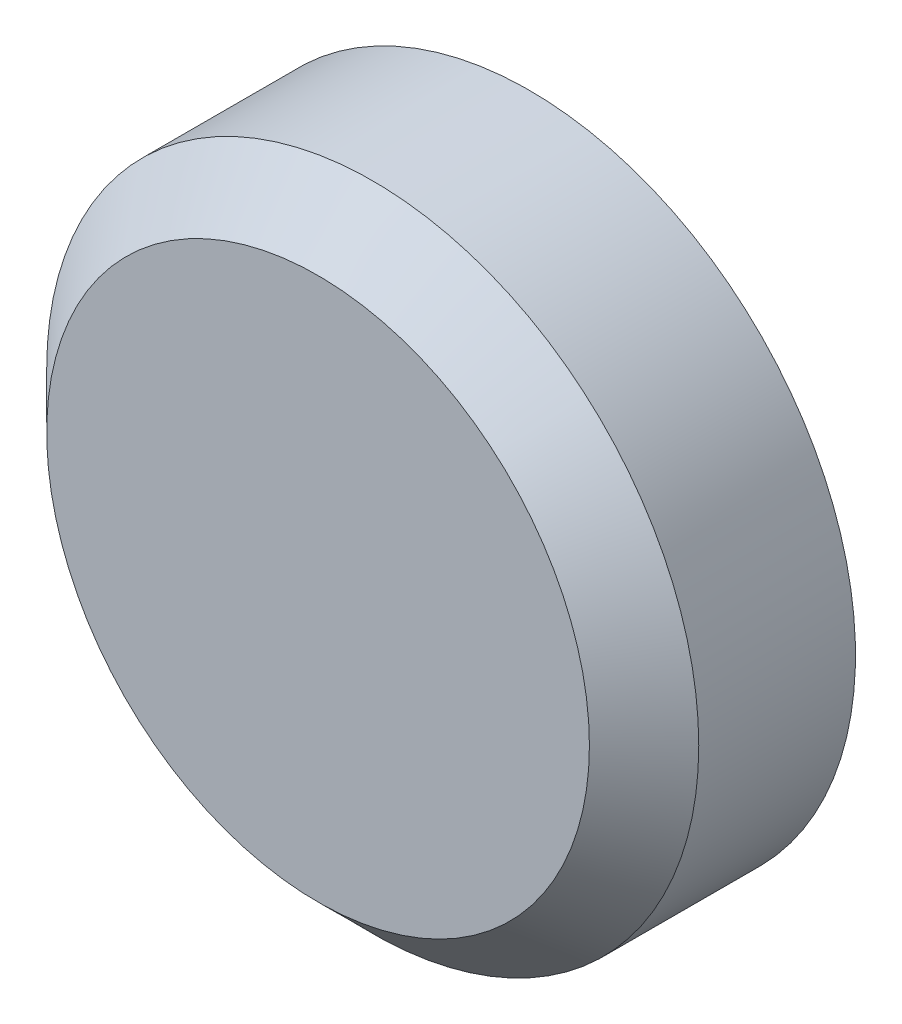
ISO-10303-21;
HEADER;
FILE_DESCRIPTION(('STEP AP214'),'2;1');
FILE_NAME('part.step','',(''),(''),'','','');
FILE_SCHEMA(('AUTOMOTIVE_DESIGN { 1 0 10303 214 1 1 1 1 }'));
ENDSEC;
DATA;
#1=APPLICATION_CONTEXT('core data for automotive mechanical design processes');
#2=APPLICATION_PROTOCOL_DEFINITION('international standard','automotive_design',2000,#1);
#3=PRODUCT_CONTEXT('',#1,'mechanical');
#4=PRODUCT('Part','Part','',(#3));
#5=PRODUCT_RELATED_PRODUCT_CATEGORY('part','',(#4));
#6=PRODUCT_DEFINITION_FORMATION('','',#4);
#7=PRODUCT_DEFINITION_CONTEXT('part definition',#1,'design');
#8=PRODUCT_DEFINITION('design','',#6,#7);
#9=PRODUCT_DEFINITION_SHAPE('','',#8);
#10=(LENGTH_UNIT() NAMED_UNIT(*) SI_UNIT(.MILLI.,.METRE.));
#11=(NAMED_UNIT(*) PLANE_ANGLE_UNIT() SI_UNIT($,.RADIAN.));
#12=(NAMED_UNIT(*) SI_UNIT($,.STERADIAN.) SOLID_ANGLE_UNIT());
#13=UNCERTAINTY_MEASURE_WITH_UNIT(LENGTH_MEASURE(1.E-05),#10,'distance_accuracy_value','');
#14=(GEOMETRIC_REPRESENTATION_CONTEXT(3) GLOBAL_UNCERTAINTY_ASSIGNED_CONTEXT((#13)) GLOBAL_UNIT_ASSIGNED_CONTEXT((#10,
#11,#12)) REPRESENTATION_CONTEXT('',''));
#15=CARTESIAN_POINT('',(0.,0.,0.));
#16=DIRECTION('',(0.,0.,1.));
#17=DIRECTION('',(1.,0.,0.));
#18=AXIS2_PLACEMENT_3D('',#15,#16,#17);
#19=CARTESIAN_POINT('',(0.,0.,0.));
#20=DIRECTION('',(0.,0.,1.));
#21=DIRECTION('',(1.,0.,0.));
#22=AXIS2_PLACEMENT_3D('',#19,#20,#21);
#23=PLANE('',#22);
#24=CARTESIAN_POINT('',(0.,0.,0.));
#25=DIRECTION('',(0.,0.,1.));
#26=DIRECTION('',(1.,0.,0.));
#27=AXIS2_PLACEMENT_3D('',#24,#25,#26);
#28=CIRCLE('',#27,79.9702662477504);
#29=CARTESIAN_POINT('',(79.9702662477504,0.,0.));
#30=VERTEX_POINT('',#29);
#31=EDGE_CURVE('E54',#30,#30,#28,.T.);
#32=ORIENTED_EDGE('',*,*,#31,.T.);
#33=EDGE_LOOP('',(#32));
#34=FACE_BOUND('',#33,.T.);
#35=CARTESIAN_POINT('',(0.,0.,0.));
#36=DIRECTION('',(0.,0.,-1.));
#37=DIRECTION('',(-1.,0.,0.));
#38=AXIS2_PLACEMENT_3D('',#35,#36,#37);
#39=CIRCLE('',#38,85.);
#40=CARTESIAN_POINT('',(-85.,0.,0.));
#41=VERTEX_POINT('',#40);
#42=EDGE_CURVE('E75',#41,#41,#39,.T.);
#43=ORIENTED_EDGE('',*,*,#42,.T.);
#44=EDGE_LOOP('',(#43));
#45=FACE_BOUND('',#44,.T.);
#46=ADVANCED_FACE('F39',(#34,#45),#23,.F.);
#47=CARTESIAN_POINT('',(0.,0.,33.));
#48=DIRECTION('',(0.,0.,-1.));
#49=DIRECTION('',(-1.,0.,0.));
#50=AXIS2_PLACEMENT_3D('',#47,#48,#49);
#51=CYLINDRICAL_SURFACE('',#50,89.45);
#52=CARTESIAN_POINT('',(0.,0.,38.));
#53=DIRECTION('',(0.,0.,1.));
#54=DIRECTION('',(1.,0.,0.));
#55=AXIS2_PLACEMENT_3D('',#52,#53,#54);
#56=CIRCLE('',#55,89.45);
#57=CARTESIAN_POINT('',(89.45,0.,38.));
#58=VERTEX_POINT('',#57);
#59=EDGE_CURVE('E65',#58,#58,#56,.F.);
#60=ORIENTED_EDGE('',*,*,#59,.T.);
#61=EDGE_LOOP('',(#60));
#62=FACE_BOUND('',#61,.T.);
#63=CARTESIAN_POINT('',(0.,0.,-5.));
#64=DIRECTION('',(0.,0.,-1.));
#65=DIRECTION('',(-1.,0.,0.));
#66=AXIS2_PLACEMENT_3D('',#63,#64,#65);
#67=CIRCLE('',#66,89.45);
#68=CARTESIAN_POINT('',(-89.45,0.,-5.));
#69=VERTEX_POINT('',#68);
#70=EDGE_CURVE('E71',#69,#69,#67,.T.);
#71=ORIENTED_EDGE('',*,*,#70,.F.);
#72=EDGE_LOOP('',(#71));
#73=FACE_BOUND('',#72,.T.);
#74=ADVANCED_FACE('F95',(#62,#73),#51,.T.);
#75=CARTESIAN_POINT('',(0.,0.,33.));
#76=DIRECTION('',(0.,0.,-1.));
#77=DIRECTION('',(-1.,0.,0.));
#78=AXIS2_PLACEMENT_3D('',#75,#76,#77);
#79=CYLINDRICAL_SURFACE('',#78,76.75);
#80=CARTESIAN_POINT('',(0.,0.,28.));
#81=DIRECTION('',(0.,0.,1.));
#82=DIRECTION('',(1.,0.,0.));
#83=AXIS2_PLACEMENT_3D('',#80,#81,#82);
#84=CIRCLE('',#83,76.75);
#85=CARTESIAN_POINT('',(76.75,0.,28.));
#86=VERTEX_POINT('',#85);
#87=EDGE_CURVE('E46',#86,#86,#84,.T.);
#88=ORIENTED_EDGE('',*,*,#87,.T.);
#89=EDGE_LOOP('',(#88));
#90=FACE_BOUND('',#89,.T.);
#91=CARTESIAN_POINT('',(0.,0.,6.76326980708465));
#92=DIRECTION('',(0.,0.,1.));
#93=DIRECTION('',(1.,0.,0.));
#94=AXIS2_PLACEMENT_3D('',#91,#92,#93);
#95=CIRCLE('',#94,76.75);
#96=CARTESIAN_POINT('',(76.75,0.,6.76326980708465));
#97=VERTEX_POINT('',#96);
#98=EDGE_CURVE('E62',#97,#97,#95,.F.);
#99=ORIENTED_EDGE('',*,*,#98,.T.);
#100=EDGE_LOOP('',(#99));
#101=FACE_BOUND('',#100,.T.);
#102=ADVANCED_FACE('F86',(#90,#101),#79,.F.);
#103=CARTESIAN_POINT('',(0.,0.,-5.));
#104=DIRECTION('',(0.,0.,-1.));
#105=DIRECTION('',(-1.,0.,0.));
#106=AXIS2_PLACEMENT_3D('',#103,#104,#105);
#107=PLANE('',#106);
#108=ORIENTED_EDGE('',*,*,#70,.T.);
#109=EDGE_LOOP('',(#108));
#110=FACE_BOUND('',#109,.T.);
#111=CARTESIAN_POINT('',(0.,0.,-5.));
#112=DIRECTION('',(0.,0.,-1.));
#113=DIRECTION('',(-1.,0.,0.));
#114=AXIS2_PLACEMENT_3D('',#111,#112,#113);
#115=CIRCLE('',#114,85.);
#116=CARTESIAN_POINT('',(-85.,0.,-5.));
#117=VERTEX_POINT('',#116);
#118=EDGE_CURVE('E74',#117,#117,#115,.T.);
#119=ORIENTED_EDGE('',*,*,#118,.F.);
#120=EDGE_LOOP('',(#119));
#121=FACE_BOUND('',#120,.T.);
#122=ADVANCED_FACE('F84',(#110,#121),#107,.T.);
#123=CARTESIAN_POINT('',(0.,0.,-5.));
#124=DIRECTION('',(0.,0.,1.));
#125=DIRECTION('',(1.,0.,0.));
#126=AXIS2_PLACEMENT_3D('',#123,#124,#125);
#127=CYLINDRICAL_SURFACE('',#126,85.);
#128=ORIENTED_EDGE('',*,*,#118,.T.);
#129=EDGE_LOOP('',(#128));
#130=FACE_BOUND('',#129,.T.);
#131=ORIENTED_EDGE('',*,*,#42,.F.);
#132=EDGE_LOOP('',(#131));
#133=FACE_BOUND('',#132,.T.);
#134=ADVANCED_FACE('F81',(#130,#133),#127,.F.);
#135=CARTESIAN_POINT('',(0.,0.,33.));
#136=DIRECTION('',(0.,0.,1.));
#137=DIRECTION('',(1.,0.,0.));
#138=AXIS2_PLACEMENT_3D('',#135,#136,#137);
#139=PLANE('',#138);
#140=CARTESIAN_POINT('',(0.,0.,33.));
#141=DIRECTION('',(0.,0.,1.));
#142=DIRECTION('',(1.,0.,0.));
#143=AXIS2_PLACEMENT_3D('',#140,#141,#142);
#144=CIRCLE('',#143,71.75);
#145=CARTESIAN_POINT('',(71.75,0.,33.));
#146=VERTEX_POINT('',#145);
#147=EDGE_CURVE('E10',#146,#146,#144,.F.);
#148=ORIENTED_EDGE('',*,*,#147,.T.);
#149=EDGE_LOOP('',(#148));
#150=FACE_BOUND('',#149,.T.);
#151=ADVANCED_FACE('F92',(#150),#139,.F.);
#152=CARTESIAN_POINT('',(0.,0.,53.));
#153=DIRECTION('',(0.,0.,1.));
#154=DIRECTION('',(1.,0.,0.));
#155=AXIS2_PLACEMENT_3D('',#152,#153,#154);
#156=PLANE('',#155);
#157=CARTESIAN_POINT('',(0.,0.,53.));
#158=DIRECTION('',(0.,0.,1.));
#159=DIRECTION('',(1.,0.,0.));
#160=AXIS2_PLACEMENT_3D('',#157,#158,#159);
#161=CIRCLE('',#160,74.45);
#162=CARTESIAN_POINT('',(74.45,0.,53.));
#163=VERTEX_POINT('',#162);
#164=EDGE_CURVE('E68',#163,#163,#161,.T.);
#165=ORIENTED_EDGE('',*,*,#164,.T.);
#166=EDGE_LOOP('',(#165));
#167=FACE_BOUND('',#166,.T.);
#168=ADVANCED_FACE('F117',(#167),#156,.T.);
#169=CARTESIAN_POINT('',(0.,0.,53.));
#170=DIRECTION('',(0.,0.,-1.));
#171=DIRECTION('',(-1.,0.,0.));
#172=AXIS2_PLACEMENT_3D('',#169,#170,#171);
#173=CONICAL_SURFACE('',#172,74.45,0.785398163397447);
#174=ORIENTED_EDGE('',*,*,#59,.F.);
#175=EDGE_LOOP('',(#174));
#176=FACE_BOUND('',#175,.T.);
#177=ORIENTED_EDGE('',*,*,#164,.F.);
#178=EDGE_LOOP('',(#177));
#179=FACE_BOUND('',#178,.T.);
#180=ADVANCED_FACE('F110',(#176,#179),#173,.T.);
#181=CARTESIAN_POINT('',(0.,0.,0.));
#182=DIRECTION('',(0.,0.,-1.));
#183=DIRECTION('',(-1.,0.,0.));
#184=AXIS2_PLACEMENT_3D('',#181,#182,#183);
#185=CONICAL_SURFACE('',#184,78.569851171331,0.349065850398864);
#186=CARTESIAN_POINT('',(0.,0.,1.31595971334867));
#187=DIRECTION('',(0.,0.,-1.));
#188=DIRECTION('',(-1.,0.,0.));
#189=AXIS2_PLACEMENT_3D('',#186,#187,#188);
#190=CIRCLE('',#189,78.0908810061786);
#191=CARTESIAN_POINT('',(-78.0908810061786,0.,1.31595971334867));
#192=VERTEX_POINT('',#191);
#193=EDGE_CURVE('E50',#192,#192,#190,.T.);
#194=ORIENTED_EDGE('',*,*,#193,.T.);
#195=EDGE_LOOP('',(#194));
#196=FACE_BOUND('',#195,.T.);
#197=CARTESIAN_POINT('',(0.,0.,3.343068373828));
#198=DIRECTION('',(0.,0.,1.));
#199=DIRECTION('',(1.,0.,0.));
#200=AXIS2_PLACEMENT_3D('',#197,#198,#199);
#201=CIRCLE('',#200,77.3530737921409);
#202=CARTESIAN_POINT('',(77.3530737921409,0.,3.343068373828));
#203=VERTEX_POINT('',#202);
#204=EDGE_CURVE('E59',#203,#203,#201,.T.);
#205=ORIENTED_EDGE('',*,*,#204,.T.);
#206=EDGE_LOOP('',(#205));
#207=FACE_BOUND('',#206,.T.);
#208=ADVANCED_FACE('F116',(#196,#207),#185,.F.);
#209=CARTESIAN_POINT('',(0.,0.,6.76326980708465));
#210=DIRECTION('',(0.,0.,1.));
#211=DIRECTION('',(1.,0.,0.));
#212=AXIS2_PLACEMENT_3D('',#209,#210,#211);
#213=TOROIDAL_SURFACE('',#212,86.75,10.);
#214=ORIENTED_EDGE('',*,*,#204,.F.);
#215=EDGE_LOOP('',(#214));
#216=FACE_BOUND('',#215,.T.);
#217=ORIENTED_EDGE('',*,*,#98,.F.);
#218=EDGE_LOOP('',(#217));
#219=FACE_BOUND('',#218,.T.);
#220=ADVANCED_FACE('F122',(#216,#219),#213,.T.);
#221=CARTESIAN_POINT('',(0.,0.,2.));
#222=DIRECTION('',(0.,0.,1.));
#223=DIRECTION('',(1.,0.,0.));
#224=AXIS2_PLACEMENT_3D('',#221,#222,#223);
#225=TOROIDAL_SURFACE('',#224,79.9702662477504,2.);
#226=ORIENTED_EDGE('',*,*,#193,.F.);
#227=EDGE_LOOP('',(#226));
#228=FACE_BOUND('',#227,.T.);
#229=ORIENTED_EDGE('',*,*,#31,.F.);
#230=EDGE_LOOP('',(#229));
#231=FACE_BOUND('',#230,.T.);
#232=ADVANCED_FACE('F124',(#228,#231),#225,.T.);
#233=CARTESIAN_POINT('',(0.,0.,28.));
#234=DIRECTION('',(0.,0.,1.));
#235=DIRECTION('',(1.,0.,0.));
#236=AXIS2_PLACEMENT_3D('',#233,#234,#235);
#237=TOROIDAL_SURFACE('',#236,71.75,5.);
#238=ORIENTED_EDGE('',*,*,#147,.F.);
#239=EDGE_LOOP('',(#238));
#240=FACE_BOUND('',#239,.T.);
#241=ORIENTED_EDGE('',*,*,#87,.F.);
#242=EDGE_LOOP('',(#241));
#243=FACE_BOUND('',#242,.T.);
#244=ADVANCED_FACE('F41',(#240,#243),#237,.F.);
#245=CLOSED_SHELL('',(#46,#74,#102,#122,#134,#151,#168,#180,#208,#220,#232,#244));
#246=MANIFOLD_SOLID_BREP('B2',#245);
#247=ADVANCED_BREP_SHAPE_REPRESENTATION('',(#18,#246),#14);
#248=SHAPE_DEFINITION_REPRESENTATION(#9,#247);
ENDSEC;
END-ISO-10303-21;
